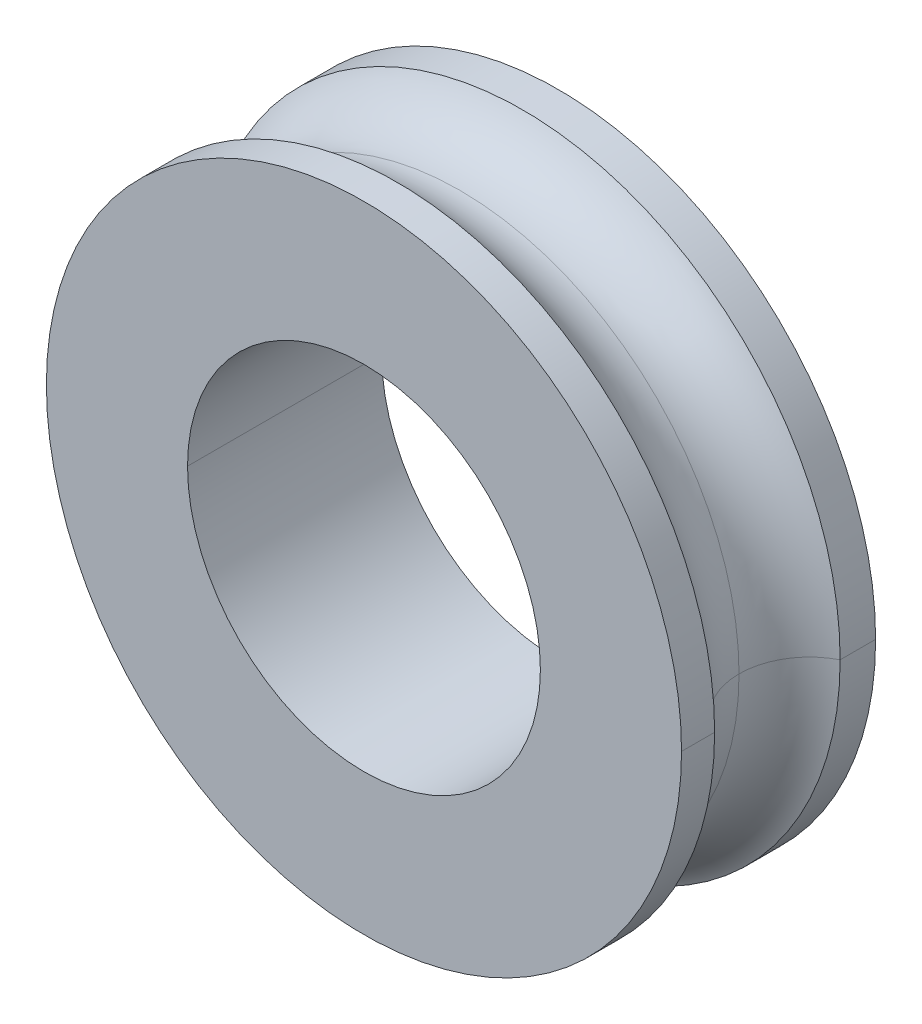
ISO-10303-21;
HEADER;
FILE_DESCRIPTION(('STEP AP214'),'2;1');
FILE_NAME('part.step','',(''),(''),'','','');
FILE_SCHEMA(('AUTOMOTIVE_DESIGN { 1 0 10303 214 1 1 1 1 }'));
ENDSEC;
DATA;
#1=APPLICATION_CONTEXT('core data for automotive mechanical design processes');
#2=APPLICATION_PROTOCOL_DEFINITION('international standard','automotive_design',2000,#1);
#3=PRODUCT_CONTEXT('',#1,'mechanical');
#4=PRODUCT('Part','Part','',(#3));
#5=PRODUCT_RELATED_PRODUCT_CATEGORY('part','',(#4));
#6=PRODUCT_DEFINITION_FORMATION('','',#4);
#7=PRODUCT_DEFINITION_CONTEXT('part definition',#1,'design');
#8=PRODUCT_DEFINITION('design','',#6,#7);
#9=PRODUCT_DEFINITION_SHAPE('','',#8);
#10=(LENGTH_UNIT() NAMED_UNIT(*) SI_UNIT(.MILLI.,.METRE.));
#11=(NAMED_UNIT(*) PLANE_ANGLE_UNIT() SI_UNIT($,.RADIAN.));
#12=(NAMED_UNIT(*) SI_UNIT($,.STERADIAN.) SOLID_ANGLE_UNIT());
#13=UNCERTAINTY_MEASURE_WITH_UNIT(LENGTH_MEASURE(1.E-05),#10,'distance_accuracy_value','');
#14=(GEOMETRIC_REPRESENTATION_CONTEXT(3) GLOBAL_UNCERTAINTY_ASSIGNED_CONTEXT((#13)) GLOBAL_UNIT_ASSIGNED_CONTEXT((#10,
#11,#12)) REPRESENTATION_CONTEXT('',''));
#15=CARTESIAN_POINT('',(0.,0.,0.));
#16=DIRECTION('',(0.,0.,1.));
#17=DIRECTION('',(1.,0.,0.));
#18=AXIS2_PLACEMENT_3D('',#15,#16,#17);
#19=CARTESIAN_POINT('',(0.,0.,2.78352783483622));
#20=DIRECTION('',(0.,0.,-1.));
#21=DIRECTION('',(-1.,0.,0.));
#22=AXIS2_PLACEMENT_3D('',#19,#20,#21);
#23=TOROIDAL_SURFACE('',#22,9.91082797758529,1.99825895623844);
#24=CARTESIAN_POINT('',(-9.91082797758529,0.,2.78352783483622));
#25=DIRECTION('',(0.,-1.,0.));
#26=DIRECTION('',(0.,0.,-1.));
#27=AXIS2_PLACEMENT_3D('',#24,#25,#26);
#28=CIRCLE('',#27,1.99825895623844);
#29=CARTESIAN_POINT('',(-9.,0.,1.00492409835216));
#30=VERTEX_POINT('',#29);
#31=CARTESIAN_POINT('',(-7.91256902134685,0.,2.78352783483622));
#32=VERTEX_POINT('',#31);
#33=EDGE_CURVE('E11',#30,#32,#28,.T.);
#34=ORIENTED_EDGE('',*,*,#33,.T.);
#35=CARTESIAN_POINT('',(0.,0.,2.78352783483622));
#36=DIRECTION('',(0.,0.,-1.));
#37=DIRECTION('',(-1.,0.,0.));
#38=AXIS2_PLACEMENT_3D('',#35,#36,#37);
#39=CIRCLE('',#38,7.91256902134685);
#40=CARTESIAN_POINT('',(7.91256902134685,0.,2.78352783483622));
#41=VERTEX_POINT('',#40);
#42=EDGE_CURVE('E28',#32,#41,#39,.T.);
#43=ORIENTED_EDGE('',*,*,#42,.T.);
#44=CARTESIAN_POINT('',(9.91082797758529,0.,2.78352783483622));
#45=DIRECTION('',(0.,1.,0.));
#46=DIRECTION('',(-1.,0.,0.));
#47=AXIS2_PLACEMENT_3D('',#44,#45,#46);
#48=CIRCLE('',#47,1.99825895623844);
#49=CARTESIAN_POINT('',(9.,0.,1.00492409835216));
#50=VERTEX_POINT('',#49);
#51=EDGE_CURVE('E184',#50,#41,#48,.T.);
#52=ORIENTED_EDGE('',*,*,#51,.F.);
#53=CARTESIAN_POINT('',(0.,0.,1.00492409835216));
#54=DIRECTION('',(0.,0.,1.));
#55=DIRECTION('',(1.,0.,0.));
#56=AXIS2_PLACEMENT_3D('',#53,#54,#55);
#57=CIRCLE('',#56,9.);
#58=EDGE_CURVE('E194',#50,#30,#57,.T.);
#59=ORIENTED_EDGE('',*,*,#58,.T.);
#60=EDGE_LOOP('',(#34,#43,#52,#59));
#61=FACE_BOUND('',#60,.T.);
#62=ADVANCED_FACE('F17',(#61),#23,.F.);
#63=CARTESIAN_POINT('',(0.,0.,2.78352783483622));
#64=DIRECTION('',(0.,0.,-1.));
#65=DIRECTION('',(-1.,0.,0.));
#66=AXIS2_PLACEMENT_3D('',#63,#64,#65);
#67=TOROIDAL_SURFACE('',#66,9.91082797758529,1.99825895623844);
#68=ORIENTED_EDGE('',*,*,#51,.T.);
#69=CARTESIAN_POINT('',(0.,0.,2.78352783483622));
#70=DIRECTION('',(0.,0.,-1.));
#71=DIRECTION('',(-1.,0.,0.));
#72=AXIS2_PLACEMENT_3D('',#69,#70,#71);
#73=CIRCLE('',#72,7.91256902134685);
#74=EDGE_CURVE('E43',#41,#32,#73,.T.);
#75=ORIENTED_EDGE('',*,*,#74,.T.);
#76=ORIENTED_EDGE('',*,*,#33,.F.);
#77=CARTESIAN_POINT('',(0.,0.,1.00492409835216));
#78=DIRECTION('',(0.,0.,1.));
#79=DIRECTION('',(1.,0.,0.));
#80=AXIS2_PLACEMENT_3D('',#77,#78,#79);
#81=CIRCLE('',#80,9.);
#82=EDGE_CURVE('E121',#30,#50,#81,.T.);
#83=ORIENTED_EDGE('',*,*,#82,.T.);
#84=EDGE_LOOP('',(#68,#75,#76,#83));
#85=FACE_BOUND('',#84,.T.);
#86=ADVANCED_FACE('F206',(#85),#67,.F.);
#87=CARTESIAN_POINT('',(0.,0.,2.78352783483622));
#88=DIRECTION('',(0.,0.,-1.));
#89=DIRECTION('',(-1.,0.,0.));
#90=AXIS2_PLACEMENT_3D('',#87,#88,#89);
#91=TOROIDAL_SURFACE('',#90,9.91082797758529,1.99825895623844);
#92=ORIENTED_EDGE('',*,*,#74,.F.);
#93=CARTESIAN_POINT('',(9.91082797758529,0.,2.78352783483622));
#94=DIRECTION('',(0.,1.,0.));
#95=DIRECTION('',(-1.,0.,0.));
#96=AXIS2_PLACEMENT_3D('',#93,#94,#95);
#97=CIRCLE('',#96,1.99825895623844);
#98=CARTESIAN_POINT('',(9.,0.,4.56213157132027));
#99=VERTEX_POINT('',#98);
#100=EDGE_CURVE('E114',#41,#99,#97,.T.);
#101=ORIENTED_EDGE('',*,*,#100,.T.);
#102=CARTESIAN_POINT('',(0.,0.,4.56213157132027));
#103=DIRECTION('',(0.,0.,-1.));
#104=DIRECTION('',(-1.,0.,0.));
#105=AXIS2_PLACEMENT_3D('',#102,#103,#104);
#106=CIRCLE('',#105,9.);
#107=CARTESIAN_POINT('',(-9.,0.,4.56213157132027));
#108=VERTEX_POINT('',#107);
#109=EDGE_CURVE('E108',#99,#108,#106,.T.);
#110=ORIENTED_EDGE('',*,*,#109,.T.);
#111=CARTESIAN_POINT('',(-9.91082797758529,0.,2.78352783483622));
#112=DIRECTION('',(0.,-1.,0.));
#113=DIRECTION('',(0.,0.,-1.));
#114=AXIS2_PLACEMENT_3D('',#111,#112,#113);
#115=CIRCLE('',#114,1.99825895623844);
#116=EDGE_CURVE('E124',#32,#108,#115,.T.);
#117=ORIENTED_EDGE('',*,*,#116,.F.);
#118=EDGE_LOOP('',(#92,#101,#110,#117));
#119=FACE_BOUND('',#118,.T.);
#120=ADVANCED_FACE('F118',(#119),#91,.F.);
#121=CARTESIAN_POINT('',(0.,0.,5.5));
#122=DIRECTION('',(0.,0.,-1.));
#123=DIRECTION('',(-1.,0.,0.));
#124=AXIS2_PLACEMENT_3D('',#121,#122,#123);
#125=CYLINDRICAL_SURFACE('',#124,5.);
#126=CARTESIAN_POINT('',(0.,0.,5.5));
#127=DIRECTION('',(0.,0.,1.));
#128=DIRECTION('',(1.,0.,0.));
#129=AXIS2_PLACEMENT_3D('',#126,#127,#128);
#130=CIRCLE('',#129,5.);
#131=CARTESIAN_POINT('',(-5.,0.,5.5));
#132=VERTEX_POINT('',#131);
#133=CARTESIAN_POINT('',(5.,0.,5.5));
#134=VERTEX_POINT('',#133);
#135=EDGE_CURVE('E115',#132,#134,#130,.T.);
#136=ORIENTED_EDGE('',*,*,#135,.T.);
#137=DIRECTION('',(0.,0.,-1.));
#138=VECTOR('',#137,1.);
#139=CARTESIAN_POINT('',(5.,0.,5.5));
#140=LINE('',#139,#138);
#141=CARTESIAN_POINT('',(5.,0.,0.));
#142=VERTEX_POINT('',#141);
#143=EDGE_CURVE('E103',#134,#142,#140,.T.);
#144=ORIENTED_EDGE('',*,*,#143,.T.);
#145=CARTESIAN_POINT('',(0.,0.,0.));
#146=DIRECTION('',(0.,0.,1.));
#147=DIRECTION('',(1.,0.,0.));
#148=AXIS2_PLACEMENT_3D('',#145,#146,#147);
#149=CIRCLE('',#148,5.);
#150=CARTESIAN_POINT('',(-5.,0.,0.));
#151=VERTEX_POINT('',#150);
#152=EDGE_CURVE('E166',#151,#142,#149,.T.);
#153=ORIENTED_EDGE('',*,*,#152,.F.);
#154=DIRECTION('',(0.,0.,-1.));
#155=VECTOR('',#154,1.);
#156=CARTESIAN_POINT('',(-5.,0.,5.5));
#157=LINE('',#156,#155);
#158=EDGE_CURVE('E132',#132,#151,#157,.T.);
#159=ORIENTED_EDGE('',*,*,#158,.F.);
#160=EDGE_LOOP('',(#136,#144,#153,#159));
#161=FACE_BOUND('',#160,.T.);
#162=ADVANCED_FACE('F19',(#161),#125,.F.);
#163=CARTESIAN_POINT('',(0.,0.,5.5));
#164=DIRECTION('',(0.,0.,-1.));
#165=DIRECTION('',(-1.,0.,0.));
#166=AXIS2_PLACEMENT_3D('',#163,#164,#165);
#167=CYLINDRICAL_SURFACE('',#166,9.);
#168=CARTESIAN_POINT('',(0.,0.,5.5));
#169=DIRECTION('',(0.,0.,1.));
#170=DIRECTION('',(1.,0.,0.));
#171=AXIS2_PLACEMENT_3D('',#168,#169,#170);
#172=CIRCLE('',#171,9.);
#173=CARTESIAN_POINT('',(9.,0.,5.5));
#174=VERTEX_POINT('',#173);
#175=CARTESIAN_POINT('',(-9.,0.,5.5));
#176=VERTEX_POINT('',#175);
#177=EDGE_CURVE('E98',#174,#176,#172,.T.);
#178=ORIENTED_EDGE('',*,*,#177,.F.);
#179=DIRECTION('',(0.,0.,-1.));
#180=VECTOR('',#179,1.);
#181=CARTESIAN_POINT('',(9.,0.,5.5));
#182=LINE('',#181,#180);
#183=EDGE_CURVE('E95',#174,#99,#182,.T.);
#184=ORIENTED_EDGE('',*,*,#183,.T.);
#185=CARTESIAN_POINT('',(0.,0.,4.56213157132027));
#186=DIRECTION('',(0.,0.,-1.));
#187=DIRECTION('',(-1.,0.,0.));
#188=AXIS2_PLACEMENT_3D('',#185,#186,#187);
#189=CIRCLE('',#188,9.);
#190=EDGE_CURVE('E89',#108,#99,#189,.T.);
#191=ORIENTED_EDGE('',*,*,#190,.F.);
#192=DIRECTION('',(0.,0.,-1.));
#193=VECTOR('',#192,1.);
#194=CARTESIAN_POINT('',(-9.,0.,5.5));
#195=LINE('',#194,#193);
#196=EDGE_CURVE('E21',#176,#108,#195,.T.);
#197=ORIENTED_EDGE('',*,*,#196,.F.);
#198=EDGE_LOOP('',(#178,#184,#191,#197));
#199=FACE_BOUND('',#198,.T.);
#200=ADVANCED_FACE('F97',(#199),#167,.T.);
#201=CARTESIAN_POINT('',(0.,0.,5.5));
#202=DIRECTION('',(0.,0.,-1.));
#203=DIRECTION('',(-1.,0.,0.));
#204=AXIS2_PLACEMENT_3D('',#201,#202,#203);
#205=CYLINDRICAL_SURFACE('',#204,9.);
#206=ORIENTED_EDGE('',*,*,#58,.F.);
#207=DIRECTION('',(0.,0.,-1.));
#208=VECTOR('',#207,1.);
#209=CARTESIAN_POINT('',(9.,0.,5.5));
#210=LINE('',#209,#208);
#211=CARTESIAN_POINT('',(9.,0.,0.));
#212=VERTEX_POINT('',#211);
#213=EDGE_CURVE('E104',#50,#212,#210,.T.);
#214=ORIENTED_EDGE('',*,*,#213,.T.);
#215=CARTESIAN_POINT('',(0.,0.,0.));
#216=DIRECTION('',(0.,0.,1.));
#217=DIRECTION('',(1.,0.,0.));
#218=AXIS2_PLACEMENT_3D('',#215,#216,#217);
#219=CIRCLE('',#218,9.);
#220=CARTESIAN_POINT('',(-9.,0.,0.));
#221=VERTEX_POINT('',#220);
#222=EDGE_CURVE('E161',#212,#221,#219,.T.);
#223=ORIENTED_EDGE('',*,*,#222,.T.);
#224=DIRECTION('',(0.,0.,-1.));
#225=VECTOR('',#224,1.);
#226=CARTESIAN_POINT('',(-9.,0.,5.5));
#227=LINE('',#226,#225);
#228=EDGE_CURVE('E163',#30,#221,#227,.T.);
#229=ORIENTED_EDGE('',*,*,#228,.F.);
#230=EDGE_LOOP('',(#206,#214,#223,#229));
#231=FACE_BOUND('',#230,.T.);
#232=ADVANCED_FACE('F208',(#231),#205,.T.);
#233=CARTESIAN_POINT('',(0.,0.,5.5));
#234=DIRECTION('',(0.,0.,-1.));
#235=DIRECTION('',(-1.,0.,0.));
#236=AXIS2_PLACEMENT_3D('',#233,#234,#235);
#237=CYLINDRICAL_SURFACE('',#236,9.);
#238=ORIENTED_EDGE('',*,*,#213,.F.);
#239=ORIENTED_EDGE('',*,*,#82,.F.);
#240=ORIENTED_EDGE('',*,*,#228,.T.);
#241=CARTESIAN_POINT('',(0.,0.,0.));
#242=DIRECTION('',(0.,0.,1.));
#243=DIRECTION('',(1.,0.,0.));
#244=AXIS2_PLACEMENT_3D('',#241,#242,#243);
#245=CIRCLE('',#244,9.);
#246=EDGE_CURVE('E185',#221,#212,#245,.T.);
#247=ORIENTED_EDGE('',*,*,#246,.T.);
#248=EDGE_LOOP('',(#238,#239,#240,#247));
#249=FACE_BOUND('',#248,.T.);
#250=ADVANCED_FACE('F214',(#249),#237,.T.);
#251=CARTESIAN_POINT('',(0.,0.,5.5));
#252=DIRECTION('',(0.,0.,-1.));
#253=DIRECTION('',(-1.,0.,0.));
#254=AXIS2_PLACEMENT_3D('',#251,#252,#253);
#255=CYLINDRICAL_SURFACE('',#254,9.);
#256=ORIENTED_EDGE('',*,*,#183,.F.);
#257=CARTESIAN_POINT('',(0.,0.,5.5));
#258=DIRECTION('',(0.,0.,1.));
#259=DIRECTION('',(1.,0.,0.));
#260=AXIS2_PLACEMENT_3D('',#257,#258,#259);
#261=CIRCLE('',#260,9.);
#262=EDGE_CURVE('E165',#176,#174,#261,.T.);
#263=ORIENTED_EDGE('',*,*,#262,.F.);
#264=ORIENTED_EDGE('',*,*,#196,.T.);
#265=ORIENTED_EDGE('',*,*,#109,.F.);
#266=EDGE_LOOP('',(#256,#263,#264,#265));
#267=FACE_BOUND('',#266,.T.);
#268=ADVANCED_FACE('F110',(#267),#255,.T.);
#269=CARTESIAN_POINT('',(0.,0.,5.5));
#270=DIRECTION('',(0.,0.,1.));
#271=DIRECTION('',(1.,0.,0.));
#272=AXIS2_PLACEMENT_3D('',#269,#270,#271);
#273=PLANE('',#272);
#274=ORIENTED_EDGE('',*,*,#262,.T.);
#275=ORIENTED_EDGE('',*,*,#177,.T.);
#276=EDGE_LOOP('',(#274,#275));
#277=FACE_BOUND('',#276,.T.);
#278=ORIENTED_EDGE('',*,*,#135,.F.);
#279=CARTESIAN_POINT('',(0.,0.,5.5));
#280=DIRECTION('',(0.,0.,1.));
#281=DIRECTION('',(1.,0.,0.));
#282=AXIS2_PLACEMENT_3D('',#279,#280,#281);
#283=CIRCLE('',#282,5.);
#284=EDGE_CURVE('E137',#134,#132,#283,.T.);
#285=ORIENTED_EDGE('',*,*,#284,.F.);
#286=EDGE_LOOP('',(#278,#285));
#287=FACE_BOUND('',#286,.T.);
#288=ADVANCED_FACE('F240',(#277,#287),#273,.T.);
#289=CARTESIAN_POINT('',(0.,0.,0.));
#290=DIRECTION('',(0.,0.,1.));
#291=DIRECTION('',(1.,0.,0.));
#292=AXIS2_PLACEMENT_3D('',#289,#290,#291);
#293=PLANE('',#292);
#294=ORIENTED_EDGE('',*,*,#246,.F.);
#295=ORIENTED_EDGE('',*,*,#222,.F.);
#296=EDGE_LOOP('',(#294,#295));
#297=FACE_BOUND('',#296,.T.);
#298=ORIENTED_EDGE('',*,*,#152,.T.);
#299=CARTESIAN_POINT('',(0.,0.,0.));
#300=DIRECTION('',(0.,0.,1.));
#301=DIRECTION('',(1.,0.,0.));
#302=AXIS2_PLACEMENT_3D('',#299,#300,#301);
#303=CIRCLE('',#302,5.);
#304=EDGE_CURVE('E139',#142,#151,#303,.T.);
#305=ORIENTED_EDGE('',*,*,#304,.T.);
#306=EDGE_LOOP('',(#298,#305));
#307=FACE_BOUND('',#306,.T.);
#308=ADVANCED_FACE('F235',(#297,#307),#293,.F.);
#309=CARTESIAN_POINT('',(0.,0.,5.5));
#310=DIRECTION('',(0.,0.,-1.));
#311=DIRECTION('',(-1.,0.,0.));
#312=AXIS2_PLACEMENT_3D('',#309,#310,#311);
#313=CYLINDRICAL_SURFACE('',#312,5.);
#314=ORIENTED_EDGE('',*,*,#143,.F.);
#315=ORIENTED_EDGE('',*,*,#284,.T.);
#316=ORIENTED_EDGE('',*,*,#158,.T.);
#317=ORIENTED_EDGE('',*,*,#304,.F.);
#318=EDGE_LOOP('',(#314,#315,#316,#317));
#319=FACE_BOUND('',#318,.T.);
#320=ADVANCED_FACE('F239',(#319),#313,.F.);
#321=CARTESIAN_POINT('',(0.,0.,2.78352783483622));
#322=DIRECTION('',(0.,0.,-1.));
#323=DIRECTION('',(-1.,0.,0.));
#324=AXIS2_PLACEMENT_3D('',#321,#322,#323);
#325=TOROIDAL_SURFACE('',#324,9.91082797758529,1.99825895623844);
#326=ORIENTED_EDGE('',*,*,#42,.F.);
#327=ORIENTED_EDGE('',*,*,#116,.T.);
#328=ORIENTED_EDGE('',*,*,#190,.T.);
#329=ORIENTED_EDGE('',*,*,#100,.F.);
#330=EDGE_LOOP('',(#326,#327,#328,#329));
#331=FACE_BOUND('',#330,.T.);
#332=ADVANCED_FACE('F123',(#331),#325,.F.);
#333=CLOSED_SHELL('',(#62,#86,#120,#162,#200,#232,#250,#268,#288,#308,#320,#332));
#334=MANIFOLD_SOLID_BREP('B1',#333);
#335=ADVANCED_BREP_SHAPE_REPRESENTATION('',(#18,#334),#14);
#336=SHAPE_DEFINITION_REPRESENTATION(#9,#335);
ENDSEC;
END-ISO-10303-21;
